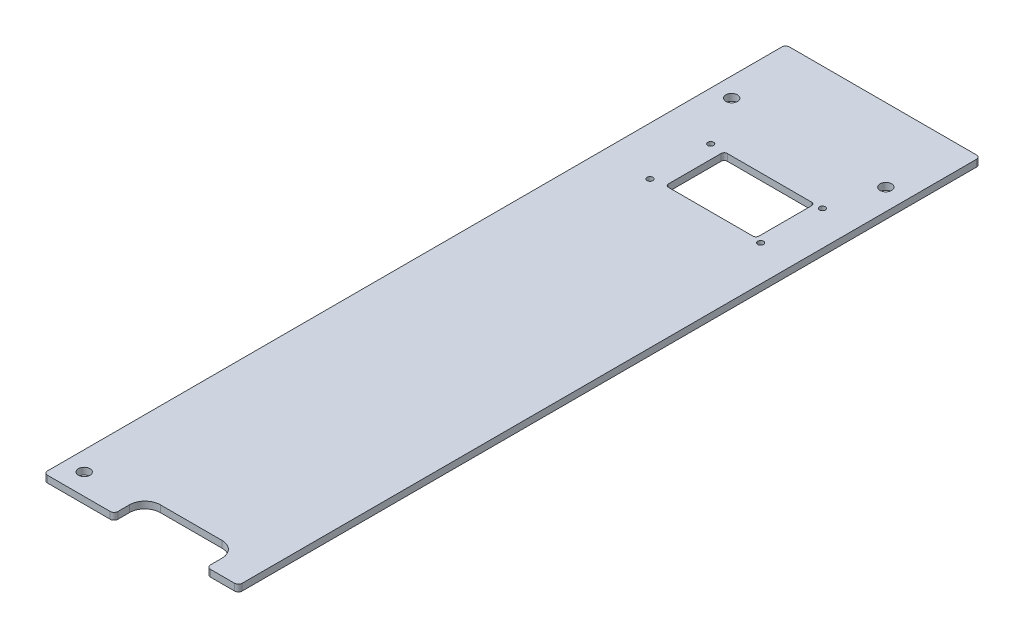
ISO-10303-21;
HEADER;
FILE_DESCRIPTION(('STEP AP214'),'2;1');
FILE_NAME('part.step','',(''),(''),'','','');
FILE_SCHEMA(('AUTOMOTIVE_DESIGN { 1 0 10303 214 1 1 1 1 }'));
ENDSEC;
DATA;
#1=APPLICATION_CONTEXT('core data for automotive mechanical design processes');
#2=APPLICATION_PROTOCOL_DEFINITION('international standard','automotive_design',2000,#1);
#3=PRODUCT_CONTEXT('',#1,'mechanical');
#4=PRODUCT('Part','Part','',(#3));
#5=PRODUCT_RELATED_PRODUCT_CATEGORY('part','',(#4));
#6=PRODUCT_DEFINITION_FORMATION('','',#4);
#7=PRODUCT_DEFINITION_CONTEXT('part definition',#1,'design');
#8=PRODUCT_DEFINITION('design','',#6,#7);
#9=PRODUCT_DEFINITION_SHAPE('','',#8);
#10=(LENGTH_UNIT() NAMED_UNIT(*) SI_UNIT(.MILLI.,.METRE.));
#11=(NAMED_UNIT(*) PLANE_ANGLE_UNIT() SI_UNIT($,.RADIAN.));
#12=(NAMED_UNIT(*) SI_UNIT($,.STERADIAN.) SOLID_ANGLE_UNIT());
#13=UNCERTAINTY_MEASURE_WITH_UNIT(LENGTH_MEASURE(1.E-05),#10,'distance_accuracy_value','');
#14=(GEOMETRIC_REPRESENTATION_CONTEXT(3) GLOBAL_UNCERTAINTY_ASSIGNED_CONTEXT((#13)) GLOBAL_UNIT_ASSIGNED_CONTEXT((#10,
#11,#12)) REPRESENTATION_CONTEXT('',''));
#15=CARTESIAN_POINT('',(0.,0.,0.));
#16=DIRECTION('',(0.,0.,1.));
#17=DIRECTION('',(1.,0.,0.));
#18=AXIS2_PLACEMENT_3D('',#15,#16,#17);
#19=CARTESIAN_POINT('',(-80.16875,5.588,305.59375));
#20=DIRECTION('',(0.,0.,-1.));
#21=DIRECTION('',(-1.,0.,0.));
#22=AXIS2_PLACEMENT_3D('',#19,#20,#21);
#23=PLANE('',#22);
#24=DIRECTION('',(1.,0.,0.));
#25=VECTOR('',#24,1.);
#26=CARTESIAN_POINT('',(-80.16875,0.,305.59375));
#27=LINE('',#26,#25);
#28=CARTESIAN_POINT('',(-76.99375,0.,305.59375));
#29=VERTEX_POINT('',#28);
#30=CARTESIAN_POINT('',(-25.4000000000001,0.,305.59375));
#31=VERTEX_POINT('',#30);
#32=EDGE_CURVE('E268',#29,#31,#27,.T.);
#33=ORIENTED_EDGE('',*,*,#32,.T.);
#34=DIRECTION('',(0.,1.,0.));
#35=VECTOR('',#34,1.);
#36=CARTESIAN_POINT('',(-25.4,5.588,305.59375));
#37=LINE('',#36,#35);
#38=CARTESIAN_POINT('',(-25.4000000000001,5.588,305.59375));
#39=VERTEX_POINT('',#38);
#40=EDGE_CURVE('E357',#31,#39,#37,.T.);
#41=ORIENTED_EDGE('',*,*,#40,.T.);
#42=DIRECTION('',(1.,0.,0.));
#43=VECTOR('',#42,1.);
#44=CARTESIAN_POINT('',(-80.16875,5.588,305.59375));
#45=LINE('',#44,#43);
#46=CARTESIAN_POINT('',(-76.99375,5.588,305.59375));
#47=VERTEX_POINT('',#46);
#48=EDGE_CURVE('E275',#47,#39,#45,.T.);
#49=ORIENTED_EDGE('',*,*,#48,.F.);
#50=DIRECTION('',(0.,-1.,0.));
#51=VECTOR('',#50,1.);
#52=CARTESIAN_POINT('',(-76.99375,5.588,305.59375));
#53=LINE('',#52,#51);
#54=EDGE_CURVE('E304',#47,#29,#53,.T.);
#55=ORIENTED_EDGE('',*,*,#54,.T.);
#56=EDGE_LOOP('',(#33,#41,#49,#55));
#57=FACE_BOUND('',#56,.T.);
#58=ADVANCED_FACE('F33',(#57),#23,.F.);
#59=CARTESIAN_POINT('',(80.16875,5.588,305.59375));
#60=DIRECTION('',(-1.,0.,0.));
#61=DIRECTION('',(0.,0.,1.));
#62=AXIS2_PLACEMENT_3D('',#59,#60,#61);
#63=PLANE('',#62);
#64=DIRECTION('',(0.,0.,-1.));
#65=VECTOR('',#64,1.);
#66=CARTESIAN_POINT('',(80.16875,5.588,305.59375));
#67=LINE('',#66,#65);
#68=CARTESIAN_POINT('',(80.16875,5.588,302.41875));
#69=VERTEX_POINT('',#68);
#70=CARTESIAN_POINT('',(80.16875,5.588,-302.41875));
#71=VERTEX_POINT('',#70);
#72=EDGE_CURVE('E264',#69,#71,#67,.T.);
#73=ORIENTED_EDGE('',*,*,#72,.F.);
#74=DIRECTION('',(0.,-1.,0.));
#75=VECTOR('',#74,1.);
#76=CARTESIAN_POINT('',(80.16875,5.588,302.41875));
#77=LINE('',#76,#75);
#78=CARTESIAN_POINT('',(80.16875,0.,302.41875));
#79=VERTEX_POINT('',#78);
#80=EDGE_CURVE('E292',#69,#79,#77,.T.);
#81=ORIENTED_EDGE('',*,*,#80,.T.);
#82=DIRECTION('',(0.,0.,-1.));
#83=VECTOR('',#82,1.);
#84=CARTESIAN_POINT('',(80.16875,0.,305.59375));
#85=LINE('',#84,#83);
#86=CARTESIAN_POINT('',(80.16875,0.,-302.41875));
#87=VERTEX_POINT('',#86);
#88=EDGE_CURVE('E279',#79,#87,#85,.T.);
#89=ORIENTED_EDGE('',*,*,#88,.T.);
#90=DIRECTION('',(0.,-1.,0.));
#91=VECTOR('',#90,1.);
#92=CARTESIAN_POINT('',(80.16875,5.588,-302.41875));
#93=LINE('',#92,#91);
#94=EDGE_CURVE('E278',#87,#71,#93,.F.);
#95=ORIENTED_EDGE('',*,*,#94,.T.);
#96=EDGE_LOOP('',(#73,#81,#89,#95));
#97=FACE_BOUND('',#96,.T.);
#98=ADVANCED_FACE('F438',(#97),#63,.F.);
#99=CARTESIAN_POINT('',(-80.16875,5.588,-305.59375));
#100=DIRECTION('',(0.,0.,1.));
#101=DIRECTION('',(1.,0.,0.));
#102=AXIS2_PLACEMENT_3D('',#99,#100,#101);
#103=PLANE('',#102);
#104=DIRECTION('',(-1.,0.,0.));
#105=VECTOR('',#104,1.);
#106=CARTESIAN_POINT('',(-80.16875,5.588,-305.59375));
#107=LINE('',#106,#105);
#108=CARTESIAN_POINT('',(76.9937499999999,5.588,-305.59375));
#109=VERTEX_POINT('',#108);
#110=CARTESIAN_POINT('',(-76.99375,5.588,-305.59375));
#111=VERTEX_POINT('',#110);
#112=EDGE_CURVE('E267',#109,#111,#107,.T.);
#113=ORIENTED_EDGE('',*,*,#112,.F.);
#114=DIRECTION('',(0.,-1.,0.));
#115=VECTOR('',#114,1.);
#116=CARTESIAN_POINT('',(76.9937499999999,5.588,-305.59375));
#117=LINE('',#116,#115);
#118=CARTESIAN_POINT('',(76.9937499999999,0.,-305.59375));
#119=VERTEX_POINT('',#118);
#120=EDGE_CURVE('E325',#109,#119,#117,.T.);
#121=ORIENTED_EDGE('',*,*,#120,.T.);
#122=DIRECTION('',(-1.,0.,0.));
#123=VECTOR('',#122,1.);
#124=CARTESIAN_POINT('',(-80.16875,0.,-305.59375));
#125=LINE('',#124,#123);
#126=CARTESIAN_POINT('',(-76.99375,0.,-305.59375));
#127=VERTEX_POINT('',#126);
#128=EDGE_CURVE('E282',#119,#127,#125,.T.);
#129=ORIENTED_EDGE('',*,*,#128,.T.);
#130=DIRECTION('',(0.,-1.,0.));
#131=VECTOR('',#130,1.);
#132=CARTESIAN_POINT('',(-76.99375,5.588,-305.59375));
#133=LINE('',#132,#131);
#134=EDGE_CURVE('E323',#127,#111,#133,.F.);
#135=ORIENTED_EDGE('',*,*,#134,.T.);
#136=EDGE_LOOP('',(#113,#121,#129,#135));
#137=FACE_BOUND('',#136,.T.);
#138=ADVANCED_FACE('F443',(#137),#103,.F.);
#139=CARTESIAN_POINT('',(-80.16875,5.588,305.59375));
#140=DIRECTION('',(1.,0.,0.));
#141=DIRECTION('',(0.,0.,-1.));
#142=AXIS2_PLACEMENT_3D('',#139,#140,#141);
#143=PLANE('',#142);
#144=DIRECTION('',(0.,0.,1.));
#145=VECTOR('',#144,1.);
#146=CARTESIAN_POINT('',(-80.16875,0.,305.59375));
#147=LINE('',#146,#145);
#148=CARTESIAN_POINT('',(-80.16875,0.,-302.41875));
#149=VERTEX_POINT('',#148);
#150=CARTESIAN_POINT('',(-80.16875,0.,302.41875));
#151=VERTEX_POINT('',#150);
#152=EDGE_CURVE('E285',#149,#151,#147,.T.);
#153=ORIENTED_EDGE('',*,*,#152,.T.);
#154=DIRECTION('',(0.,-1.,0.));
#155=VECTOR('',#154,1.);
#156=CARTESIAN_POINT('',(-80.16875,5.588,302.41875));
#157=LINE('',#156,#155);
#158=CARTESIAN_POINT('',(-80.16875,5.588,302.41875));
#159=VERTEX_POINT('',#158);
#160=EDGE_CURVE('E321',#151,#159,#157,.F.);
#161=ORIENTED_EDGE('',*,*,#160,.T.);
#162=DIRECTION('',(0.,0.,1.));
#163=VECTOR('',#162,1.);
#164=CARTESIAN_POINT('',(-80.16875,5.588,305.59375));
#165=LINE('',#164,#163);
#166=CARTESIAN_POINT('',(-80.16875,5.588,-302.41875));
#167=VERTEX_POINT('',#166);
#168=EDGE_CURVE('E271',#167,#159,#165,.T.);
#169=ORIENTED_EDGE('',*,*,#168,.F.);
#170=DIRECTION('',(0.,-1.,0.));
#171=VECTOR('',#170,1.);
#172=CARTESIAN_POINT('',(-80.16875,5.588,-302.41875));
#173=LINE('',#172,#171);
#174=EDGE_CURVE('E318',#167,#149,#173,.T.);
#175=ORIENTED_EDGE('',*,*,#174,.T.);
#176=EDGE_LOOP('',(#153,#161,#169,#175));
#177=FACE_BOUND('',#176,.T.);
#178=ADVANCED_FACE('F431',(#177),#143,.F.);
#179=CARTESIAN_POINT('',(57.1499999999999,5.588,305.59375));
#180=VERTEX_POINT('',#179);
#181=CARTESIAN_POINT('',(76.9937499999999,5.588,305.59375));
#182=VERTEX_POINT('',#181);
#183=EDGE_CURVE('E274',#180,#182,#45,.T.);
#184=ORIENTED_EDGE('',*,*,#183,.F.);
#185=DIRECTION('',(0.,1.,0.));
#186=VECTOR('',#185,1.);
#187=CARTESIAN_POINT('',(57.1499999999999,5.588,305.59375));
#188=LINE('',#187,#186);
#189=CARTESIAN_POINT('',(57.1499999999999,0.,305.59375));
#190=VERTEX_POINT('',#189);
#191=EDGE_CURVE('E350',#180,#190,#188,.F.);
#192=ORIENTED_EDGE('',*,*,#191,.T.);
#193=CARTESIAN_POINT('',(76.9937499999999,0.,305.59375));
#194=VERTEX_POINT('',#193);
#195=EDGE_CURVE('E288',#190,#194,#27,.T.);
#196=ORIENTED_EDGE('',*,*,#195,.T.);
#197=DIRECTION('',(0.,-1.,0.));
#198=VECTOR('',#197,1.);
#199=CARTESIAN_POINT('',(76.9937499999999,5.588,305.59375));
#200=LINE('',#199,#198);
#201=EDGE_CURVE('E307',#194,#182,#200,.F.);
#202=ORIENTED_EDGE('',*,*,#201,.T.);
#203=EDGE_LOOP('',(#184,#192,#196,#202));
#204=FACE_BOUND('',#203,.T.);
#205=ADVANCED_FACE('F421',(#204),#23,.F.);
#206=CARTESIAN_POINT('',(0.,5.588,0.));
#207=DIRECTION('',(0.,-1.,0.));
#208=DIRECTION('',(0.,0.,-1.));
#209=AXIS2_PLACEMENT_3D('',#206,#207,#208);
#210=PLANE('',#209);
#211=CARTESIAN_POINT('',(50.8952499999905,5.588,-153.95575));
#212=DIRECTION('',(0.,1.,0.));
#213=DIRECTION('',(0.,0.,1.));
#214=AXIS2_PLACEMENT_3D('',#211,#212,#213);
#215=CIRCLE('',#214,2.38125000000003);
#216=CARTESIAN_POINT('',(50.8952499999905,5.588,-151.5745));
#217=VERTEX_POINT('',#216);
#218=EDGE_CURVE('E411',#217,#217,#215,.T.);
#219=ORIENTED_EDGE('',*,*,#218,.F.);
#220=EDGE_LOOP('',(#219));
#221=FACE_BOUND('',#220,.T.);
#222=CARTESIAN_POINT('',(51.7450513885221,5.588,-203.99375));
#223=DIRECTION('',(0.,1.,0.));
#224=DIRECTION('',(0.,0.,1.));
#225=AXIS2_PLACEMENT_3D('',#222,#223,#224);
#226=CIRCLE('',#225,2.38125000000001);
#227=CARTESIAN_POINT('',(51.7450513885221,5.588,-201.6125));
#228=VERTEX_POINT('',#227);
#229=EDGE_CURVE('E401',#228,#228,#226,.T.);
#230=ORIENTED_EDGE('',*,*,#229,.F.);
#231=EDGE_LOOP('',(#230));
#232=FACE_BOUND('',#231,.T.);
#233=CARTESIAN_POINT('',(-40.2907500000095,5.588,-153.95575));
#234=DIRECTION('',(0.,1.,0.));
#235=DIRECTION('',(0.,0.,1.));
#236=AXIS2_PLACEMENT_3D('',#233,#234,#235);
#237=CIRCLE('',#236,2.38125000000003);
#238=CARTESIAN_POINT('',(-40.2907500000095,5.588,-151.5745));
#239=VERTEX_POINT('',#238);
#240=EDGE_CURVE('E398',#239,#239,#237,.T.);
#241=ORIENTED_EDGE('',*,*,#240,.F.);
#242=EDGE_LOOP('',(#241));
#243=FACE_BOUND('',#242,.T.);
#244=CARTESIAN_POINT('',(-40.2907500000095,5.588,-203.99375));
#245=DIRECTION('',(0.,1.,0.));
#246=DIRECTION('',(0.,0.,1.));
#247=AXIS2_PLACEMENT_3D('',#244,#245,#246);
#248=CIRCLE('',#247,2.38125000000003);
#249=CARTESIAN_POINT('',(-40.2907500000095,5.588,-201.6125));
#250=VERTEX_POINT('',#249);
#251=EDGE_CURVE('E395',#250,#250,#248,.T.);
#252=ORIENTED_EDGE('',*,*,#251,.F.);
#253=EDGE_LOOP('',(#252));
#254=FACE_BOUND('',#253,.T.);
#255=DIRECTION('',(0.,0.,-1.));
#256=VECTOR('',#255,1.);
#257=CARTESIAN_POINT('',(45.3793428288734,5.588,-201.45375));
#258=LINE('',#257,#256);
#259=CARTESIAN_POINT('',(45.3793428288734,5.588,-158.115));
#260=VERTEX_POINT('',#259);
#261=CARTESIAN_POINT('',(45.3793428288734,5.588,-201.45375));
#262=VERTEX_POINT('',#261);
#263=EDGE_CURVE('E207',#260,#262,#258,.T.);
#264=ORIENTED_EDGE('',*,*,#263,.F.);
#265=CARTESIAN_POINT('',(42.8393428288734,5.588,-158.115));
#266=DIRECTION('',(0.,1.,0.));
#267=DIRECTION('',(0.,0.,1.));
#268=AXIS2_PLACEMENT_3D('',#265,#266,#267);
#269=CIRCLE('',#268,2.53999999999999);
#270=CARTESIAN_POINT('',(42.8393428288734,5.588,-155.575));
#271=VERTEX_POINT('',#270);
#272=EDGE_CURVE('E50',#271,#260,#269,.T.);
#273=ORIENTED_EDGE('',*,*,#272,.F.);
#274=DIRECTION('',(1.,0.,0.));
#275=VECTOR('',#274,1.);
#276=CARTESIAN_POINT('',(-26.6382500000095,5.588,-155.575));
#277=LINE('',#276,#275);
#278=CARTESIAN_POINT('',(-26.6382500000095,5.588,-155.575));
#279=VERTEX_POINT('',#278);
#280=EDGE_CURVE('E229',#279,#271,#277,.T.);
#281=ORIENTED_EDGE('',*,*,#280,.F.);
#282=CARTESIAN_POINT('',(-26.6382500000095,5.588,-158.115));
#283=DIRECTION('',(0.,1.,0.));
#284=DIRECTION('',(0.,0.,1.));
#285=AXIS2_PLACEMENT_3D('',#282,#283,#284);
#286=CIRCLE('',#285,2.53999999999999);
#287=CARTESIAN_POINT('',(-29.1782500000095,5.588,-158.115));
#288=VERTEX_POINT('',#287);
#289=EDGE_CURVE('E226',#288,#279,#286,.T.);
#290=ORIENTED_EDGE('',*,*,#289,.F.);
#291=DIRECTION('',(0.,0.,1.));
#292=VECTOR('',#291,1.);
#293=CARTESIAN_POINT('',(-29.1782500000095,5.588,-201.45375));
#294=LINE('',#293,#292);
#295=CARTESIAN_POINT('',(-29.1782500000095,5.588,-201.45375));
#296=VERTEX_POINT('',#295);
#297=EDGE_CURVE('E223',#296,#288,#294,.T.);
#298=ORIENTED_EDGE('',*,*,#297,.F.);
#299=CARTESIAN_POINT('',(-26.6382500000095,5.588,-201.45375));
#300=DIRECTION('',(0.,1.,0.));
#301=DIRECTION('',(0.,0.,1.));
#302=AXIS2_PLACEMENT_3D('',#299,#300,#301);
#303=CIRCLE('',#302,2.53999999999999);
#304=CARTESIAN_POINT('',(-26.6382500000095,5.588,-203.99375));
#305=VERTEX_POINT('',#304);
#306=EDGE_CURVE('E217',#305,#296,#303,.T.);
#307=ORIENTED_EDGE('',*,*,#306,.F.);
#308=DIRECTION('',(-1.,0.,0.));
#309=VECTOR('',#308,1.);
#310=CARTESIAN_POINT('',(-26.6382500000095,5.588,-203.99375));
#311=LINE('',#310,#309);
#312=CARTESIAN_POINT('',(42.8393428288734,5.588,-203.99375));
#313=VERTEX_POINT('',#312);
#314=EDGE_CURVE('E215',#313,#305,#311,.T.);
#315=ORIENTED_EDGE('',*,*,#314,.F.);
#316=CARTESIAN_POINT('',(42.8393428288734,5.588,-201.45375));
#317=DIRECTION('',(0.,1.,0.));
#318=DIRECTION('',(0.,0.,-1.));
#319=AXIS2_PLACEMENT_3D('',#316,#317,#318);
#320=CIRCLE('',#319,2.53999999999999);
#321=EDGE_CURVE('E198',#262,#313,#320,.T.);
#322=ORIENTED_EDGE('',*,*,#321,.F.);
#323=EDGE_LOOP('',(#264,#273,#281,#290,#298,#307,#315,#322));
#324=FACE_BOUND('',#323,.T.);
#325=CARTESIAN_POINT('',(-64.29375,5.588,288.13125));
#326=DIRECTION('',(0.,1.,0.));
#327=DIRECTION('',(0.,0.,1.));
#328=AXIS2_PLACEMENT_3D('',#325,#326,#327);
#329=CIRCLE('',#328,4.7625);
#330=CARTESIAN_POINT('',(-64.29375,5.588,292.89375));
#331=VERTEX_POINT('',#330);
#332=EDGE_CURVE('E252',#331,#331,#329,.T.);
#333=ORIENTED_EDGE('',*,*,#332,.F.);
#334=EDGE_LOOP('',(#333));
#335=FACE_BOUND('',#334,.T.);
#336=CARTESIAN_POINT('',(-64.29375,5.588,-245.26875));
#337=DIRECTION('',(0.,1.,0.));
#338=DIRECTION('',(0.,0.,1.));
#339=AXIS2_PLACEMENT_3D('',#336,#337,#338);
#340=CIRCLE('',#339,4.7625);
#341=CARTESIAN_POINT('',(-64.29375,5.588,-240.50625));
#342=VERTEX_POINT('',#341);
#343=EDGE_CURVE('E256',#342,#342,#340,.T.);
#344=ORIENTED_EDGE('',*,*,#343,.F.);
#345=EDGE_LOOP('',(#344));
#346=FACE_BOUND('',#345,.T.);
#347=CARTESIAN_POINT('',(62.70625,5.588,-245.26875));
#348=DIRECTION('',(0.,1.,0.));
#349=DIRECTION('',(0.,0.,1.));
#350=AXIS2_PLACEMENT_3D('',#347,#348,#349);
#351=CIRCLE('',#350,4.7625);
#352=CARTESIAN_POINT('',(62.70625,5.588,-240.50625));
#353=VERTEX_POINT('',#352);
#354=EDGE_CURVE('E260',#353,#353,#351,.T.);
#355=ORIENTED_EDGE('',*,*,#354,.F.);
#356=EDGE_LOOP('',(#355));
#357=FACE_BOUND('',#356,.T.);
#358=DIRECTION('',(0.,0.,-1.));
#359=VECTOR('',#358,1.);
#360=CARTESIAN_POINT('',(53.975,5.588,305.59375));
#361=LINE('',#360,#359);
#362=CARTESIAN_POINT('',(53.975,5.588,302.41875));
#363=VERTEX_POINT('',#362);
#364=CARTESIAN_POINT('',(53.975,5.588,292.89375));
#365=VERTEX_POINT('',#364);
#366=EDGE_CURVE('E246',#363,#365,#361,.T.);
#367=ORIENTED_EDGE('',*,*,#366,.F.);
#368=CARTESIAN_POINT('',(57.1499999999999,5.588,302.41875));
#369=DIRECTION('',(0.,-1.,0.));
#370=DIRECTION('',(0.,0.,-1.));
#371=AXIS2_PLACEMENT_3D('',#368,#369,#370);
#372=CIRCLE('',#371,3.175);
#373=EDGE_CURVE('E348',#363,#180,#372,.F.);
#374=ORIENTED_EDGE('',*,*,#373,.T.);
#375=ORIENTED_EDGE('',*,*,#183,.T.);
#376=CARTESIAN_POINT('',(76.99375,5.588,302.41875));
#377=DIRECTION('',(0.,-1.,0.));
#378=DIRECTION('',(0.,0.,-1.));
#379=AXIS2_PLACEMENT_3D('',#376,#377,#378);
#380=CIRCLE('',#379,3.175);
#381=EDGE_CURVE('E316',#182,#69,#380,.F.);
#382=ORIENTED_EDGE('',*,*,#381,.T.);
#383=ORIENTED_EDGE('',*,*,#72,.T.);
#384=CARTESIAN_POINT('',(76.9937499999999,5.588,-302.41875));
#385=DIRECTION('',(0.,-1.,0.));
#386=DIRECTION('',(0.,0.,-1.));
#387=AXIS2_PLACEMENT_3D('',#384,#385,#386);
#388=CIRCLE('',#387,3.175);
#389=EDGE_CURVE('E312',#71,#109,#388,.F.);
#390=ORIENTED_EDGE('',*,*,#389,.T.);
#391=ORIENTED_EDGE('',*,*,#112,.T.);
#392=CARTESIAN_POINT('',(-76.99375,5.588,-302.41875));
#393=DIRECTION('',(0.,-1.,0.));
#394=DIRECTION('',(0.,0.,-1.));
#395=AXIS2_PLACEMENT_3D('',#392,#393,#394);
#396=CIRCLE('',#395,3.175);
#397=EDGE_CURVE('E310',#111,#167,#396,.F.);
#398=ORIENTED_EDGE('',*,*,#397,.T.);
#399=ORIENTED_EDGE('',*,*,#168,.T.);
#400=CARTESIAN_POINT('',(-76.99375,5.588,302.41875));
#401=DIRECTION('',(0.,-1.,0.));
#402=DIRECTION('',(0.,0.,-1.));
#403=AXIS2_PLACEMENT_3D('',#400,#401,#402);
#404=CIRCLE('',#403,3.175);
#405=EDGE_CURVE('E314',#159,#47,#404,.F.);
#406=ORIENTED_EDGE('',*,*,#405,.T.);
#407=ORIENTED_EDGE('',*,*,#48,.T.);
#408=CARTESIAN_POINT('',(-25.4,5.588,302.41875));
#409=DIRECTION('',(0.,-1.,0.));
#410=DIRECTION('',(0.,0.,-1.));
#411=AXIS2_PLACEMENT_3D('',#408,#409,#410);
#412=CIRCLE('',#411,3.175);
#413=CARTESIAN_POINT('',(-22.225,5.588,302.41875));
#414=VERTEX_POINT('',#413);
#415=EDGE_CURVE('E345',#39,#414,#412,.F.);
#416=ORIENTED_EDGE('',*,*,#415,.T.);
#417=DIRECTION('',(0.,0.,1.));
#418=VECTOR('',#417,1.);
#419=CARTESIAN_POINT('',(-22.225,5.588,305.59375));
#420=LINE('',#419,#418);
#421=CARTESIAN_POINT('',(-22.225,5.588,292.89375));
#422=VERTEX_POINT('',#421);
#423=EDGE_CURVE('E234',#422,#414,#420,.T.);
#424=ORIENTED_EDGE('',*,*,#423,.F.);
#425=CARTESIAN_POINT('',(-9.52500000000004,5.588,292.89375));
#426=DIRECTION('',(0.,-1.,0.));
#427=DIRECTION('',(0.,0.,-1.));
#428=AXIS2_PLACEMENT_3D('',#425,#426,#427);
#429=CIRCLE('',#428,12.7);
#430=CARTESIAN_POINT('',(-9.52500000000005,5.588,280.19375));
#431=VERTEX_POINT('',#430);
#432=EDGE_CURVE('E376',#422,#431,#429,.T.);
#433=ORIENTED_EDGE('',*,*,#432,.T.);
#434=DIRECTION('',(-1.,0.,0.));
#435=VECTOR('',#434,1.);
#436=CARTESIAN_POINT('',(-22.225,5.588,280.19375));
#437=LINE('',#436,#435);
#438=CARTESIAN_POINT('',(41.2749999999999,5.588,280.19375));
#439=VERTEX_POINT('',#438);
#440=EDGE_CURVE('E249',#439,#431,#437,.T.);
#441=ORIENTED_EDGE('',*,*,#440,.F.);
#442=CARTESIAN_POINT('',(41.275,5.588,292.89375));
#443=DIRECTION('',(0.,-1.,0.));
#444=DIRECTION('',(0.,0.,-1.));
#445=AXIS2_PLACEMENT_3D('',#442,#443,#444);
#446=CIRCLE('',#445,12.7);
#447=EDGE_CURVE('E372',#439,#365,#446,.T.);
#448=ORIENTED_EDGE('',*,*,#447,.T.);
#449=EDGE_LOOP('',(#367,#374,#375,#382,#383,#390,#391,#398,#399,#406,#407,#416,#424,#433,#441,#448));
#450=FACE_BOUND('',#449,.T.);
#451=ADVANCED_FACE('F211',(#221,#232,#243,#254,#324,#335,#346,#357,#450),#210,.F.);
#452=CARTESIAN_POINT('',(0.,0.,0.));
#453=DIRECTION('',(0.,-1.,0.));
#454=DIRECTION('',(0.,0.,-1.));
#455=AXIS2_PLACEMENT_3D('',#452,#453,#454);
#456=PLANE('',#455);
#457=CARTESIAN_POINT('',(50.8952499999905,0.,-153.95575));
#458=DIRECTION('',(0.,-1.,0.));
#459=DIRECTION('',(0.,0.,-1.));
#460=AXIS2_PLACEMENT_3D('',#457,#458,#459);
#461=CIRCLE('',#460,2.38125000000003);
#462=CARTESIAN_POINT('',(50.8952499999905,0.,-156.337));
#463=VERTEX_POINT('',#462);
#464=EDGE_CURVE('E37',#463,#463,#461,.T.);
#465=ORIENTED_EDGE('',*,*,#464,.F.);
#466=EDGE_LOOP('',(#465));
#467=FACE_BOUND('',#466,.T.);
#468=CARTESIAN_POINT('',(51.7450513885221,0.,-203.99375));
#469=DIRECTION('',(0.,-1.,0.));
#470=DIRECTION('',(0.,0.,-1.));
#471=AXIS2_PLACEMENT_3D('',#468,#469,#470);
#472=CIRCLE('',#471,2.38125000000001);
#473=CARTESIAN_POINT('',(51.7450513885221,0.,-206.375));
#474=VERTEX_POINT('',#473);
#475=EDGE_CURVE('E399',#474,#474,#472,.T.);
#476=ORIENTED_EDGE('',*,*,#475,.F.);
#477=EDGE_LOOP('',(#476));
#478=FACE_BOUND('',#477,.T.);
#479=CARTESIAN_POINT('',(-40.2907500000095,0.,-153.95575));
#480=DIRECTION('',(0.,-1.,0.));
#481=DIRECTION('',(0.,0.,-1.));
#482=AXIS2_PLACEMENT_3D('',#479,#480,#481);
#483=CIRCLE('',#482,2.38125000000003);
#484=CARTESIAN_POINT('',(-40.2907500000095,0.,-156.337));
#485=VERTEX_POINT('',#484);
#486=EDGE_CURVE('E396',#485,#485,#483,.T.);
#487=ORIENTED_EDGE('',*,*,#486,.F.);
#488=EDGE_LOOP('',(#487));
#489=FACE_BOUND('',#488,.T.);
#490=CARTESIAN_POINT('',(-40.2907500000095,0.,-203.99375));
#491=DIRECTION('',(0.,-1.,0.));
#492=DIRECTION('',(0.,0.,-1.));
#493=AXIS2_PLACEMENT_3D('',#490,#491,#492);
#494=CIRCLE('',#493,2.38125000000003);
#495=CARTESIAN_POINT('',(-40.2907500000095,0.,-206.375));
#496=VERTEX_POINT('',#495);
#497=EDGE_CURVE('E392',#496,#496,#494,.T.);
#498=ORIENTED_EDGE('',*,*,#497,.F.);
#499=EDGE_LOOP('',(#498));
#500=FACE_BOUND('',#499,.T.);
#501=CARTESIAN_POINT('',(42.8393428288734,0.,-158.115));
#502=DIRECTION('',(0.,-1.,0.));
#503=DIRECTION('',(0.,0.,-1.));
#504=AXIS2_PLACEMENT_3D('',#501,#502,#503);
#505=CIRCLE('',#504,2.53999999999999);
#506=CARTESIAN_POINT('',(45.3793428288734,0.,-158.115));
#507=VERTEX_POINT('',#506);
#508=CARTESIAN_POINT('',(42.8393428288734,0.,-155.575));
#509=VERTEX_POINT('',#508);
#510=EDGE_CURVE('E11',#507,#509,#505,.T.);
#511=ORIENTED_EDGE('',*,*,#510,.F.);
#512=DIRECTION('',(0.,0.,1.));
#513=VECTOR('',#512,1.);
#514=CARTESIAN_POINT('',(45.3793428288735,0.,0.));
#515=LINE('',#514,#513);
#516=CARTESIAN_POINT('',(45.3793428288734,0.,-201.45375));
#517=VERTEX_POINT('',#516);
#518=EDGE_CURVE('E380',#517,#507,#515,.T.);
#519=ORIENTED_EDGE('',*,*,#518,.F.);
#520=CARTESIAN_POINT('',(42.8393428288734,0.,-201.45375));
#521=DIRECTION('',(0.,-1.,0.));
#522=DIRECTION('',(0.,0.,-1.));
#523=AXIS2_PLACEMENT_3D('',#520,#521,#522);
#524=CIRCLE('',#523,2.53999999999999);
#525=CARTESIAN_POINT('',(42.8393428288734,0.,-203.99375));
#526=VERTEX_POINT('',#525);
#527=EDGE_CURVE('E201',#526,#517,#524,.T.);
#528=ORIENTED_EDGE('',*,*,#527,.F.);
#529=DIRECTION('',(1.,0.,0.));
#530=VECTOR('',#529,1.);
#531=CARTESIAN_POINT('',(0.,0.,-203.99375));
#532=LINE('',#531,#530);
#533=CARTESIAN_POINT('',(-26.6382500000095,0.,-203.99375));
#534=VERTEX_POINT('',#533);
#535=EDGE_CURVE('E383',#534,#526,#532,.T.);
#536=ORIENTED_EDGE('',*,*,#535,.F.);
#537=CARTESIAN_POINT('',(-26.6382500000095,0.,-201.45375));
#538=DIRECTION('',(0.,-1.,0.));
#539=DIRECTION('',(0.,0.,-1.));
#540=AXIS2_PLACEMENT_3D('',#537,#538,#539);
#541=CIRCLE('',#540,2.53999999999999);
#542=CARTESIAN_POINT('',(-29.1782500000095,0.,-201.45375));
#543=VERTEX_POINT('',#542);
#544=EDGE_CURVE('E385',#543,#534,#541,.T.);
#545=ORIENTED_EDGE('',*,*,#544,.F.);
#546=DIRECTION('',(0.,0.,-1.));
#547=VECTOR('',#546,1.);
#548=CARTESIAN_POINT('',(-29.1782500000095,0.,0.));
#549=LINE('',#548,#547);
#550=CARTESIAN_POINT('',(-29.1782500000095,0.,-158.115));
#551=VERTEX_POINT('',#550);
#552=EDGE_CURVE('E387',#551,#543,#549,.T.);
#553=ORIENTED_EDGE('',*,*,#552,.F.);
#554=CARTESIAN_POINT('',(-26.6382500000095,0.,-158.115));
#555=DIRECTION('',(0.,-1.,0.));
#556=DIRECTION('',(0.,0.,-1.));
#557=AXIS2_PLACEMENT_3D('',#554,#555,#556);
#558=CIRCLE('',#557,2.53999999999999);
#559=CARTESIAN_POINT('',(-26.6382500000095,0.,-155.575));
#560=VERTEX_POINT('',#559);
#561=EDGE_CURVE('E389',#560,#551,#558,.T.);
#562=ORIENTED_EDGE('',*,*,#561,.F.);
#563=DIRECTION('',(-1.,0.,0.));
#564=VECTOR('',#563,1.);
#565=CARTESIAN_POINT('',(0.,0.,-155.575));
#566=LINE('',#565,#564);
#567=EDGE_CURVE('E42',#509,#560,#566,.T.);
#568=ORIENTED_EDGE('',*,*,#567,.F.);
#569=EDGE_LOOP('',(#511,#519,#528,#536,#545,#553,#562,#568));
#570=FACE_BOUND('',#569,.T.);
#571=ORIENTED_EDGE('',*,*,#195,.F.);
#572=CARTESIAN_POINT('',(57.1499999999999,0.,302.41875));
#573=DIRECTION('',(0.,-1.,0.));
#574=DIRECTION('',(0.,0.,-1.));
#575=AXIS2_PLACEMENT_3D('',#572,#573,#574);
#576=CIRCLE('',#575,3.175);
#577=CARTESIAN_POINT('',(53.975,0.,302.41875));
#578=VERTEX_POINT('',#577);
#579=EDGE_CURVE('E354',#190,#578,#576,.T.);
#580=ORIENTED_EDGE('',*,*,#579,.T.);
#581=DIRECTION('',(0.,0.,1.));
#582=VECTOR('',#581,1.);
#583=CARTESIAN_POINT('',(53.975,0.,0.));
#584=LINE('',#583,#582);
#585=CARTESIAN_POINT('',(53.975,0.,292.89375));
#586=VERTEX_POINT('',#585);
#587=EDGE_CURVE('E328',#586,#578,#584,.T.);
#588=ORIENTED_EDGE('',*,*,#587,.F.);
#589=CARTESIAN_POINT('',(41.275,0.,292.89375));
#590=DIRECTION('',(0.,-1.,0.));
#591=DIRECTION('',(0.,0.,-1.));
#592=AXIS2_PLACEMENT_3D('',#589,#590,#591);
#593=CIRCLE('',#592,12.7);
#594=CARTESIAN_POINT('',(41.275,0.,280.19375));
#595=VERTEX_POINT('',#594);
#596=EDGE_CURVE('E374',#586,#595,#593,.F.);
#597=ORIENTED_EDGE('',*,*,#596,.T.);
#598=DIRECTION('',(1.,0.,0.));
#599=VECTOR('',#598,1.);
#600=CARTESIAN_POINT('',(0.,0.,280.19375));
#601=LINE('',#600,#599);
#602=CARTESIAN_POINT('',(-9.52500000000004,0.,280.19375));
#603=VERTEX_POINT('',#602);
#604=EDGE_CURVE('E336',#603,#595,#601,.T.);
#605=ORIENTED_EDGE('',*,*,#604,.F.);
#606=CARTESIAN_POINT('',(-9.52500000000004,0.,292.89375));
#607=DIRECTION('',(0.,-1.,0.));
#608=DIRECTION('',(0.,0.,-1.));
#609=AXIS2_PLACEMENT_3D('',#606,#607,#608);
#610=CIRCLE('',#609,12.7);
#611=CARTESIAN_POINT('',(-22.225,0.,292.89375));
#612=VERTEX_POINT('',#611);
#613=EDGE_CURVE('E378',#603,#612,#610,.F.);
#614=ORIENTED_EDGE('',*,*,#613,.T.);
#615=DIRECTION('',(0.,0.,-1.));
#616=VECTOR('',#615,1.);
#617=CARTESIAN_POINT('',(-22.225,0.,0.));
#618=LINE('',#617,#616);
#619=CARTESIAN_POINT('',(-22.225,0.,302.41875));
#620=VERTEX_POINT('',#619);
#621=EDGE_CURVE('E339',#620,#612,#618,.T.);
#622=ORIENTED_EDGE('',*,*,#621,.F.);
#623=CARTESIAN_POINT('',(-25.4,0.,302.41875));
#624=DIRECTION('',(0.,-1.,0.));
#625=DIRECTION('',(0.,0.,-1.));
#626=AXIS2_PLACEMENT_3D('',#623,#624,#625);
#627=CIRCLE('',#626,3.175);
#628=EDGE_CURVE('E352',#620,#31,#627,.T.);
#629=ORIENTED_EDGE('',*,*,#628,.T.);
#630=ORIENTED_EDGE('',*,*,#32,.F.);
#631=CARTESIAN_POINT('',(-76.99375,0.,302.41875));
#632=DIRECTION('',(0.,-1.,0.));
#633=DIRECTION('',(0.,0.,-1.));
#634=AXIS2_PLACEMENT_3D('',#631,#632,#633);
#635=CIRCLE('',#634,3.175);
#636=EDGE_CURVE('E299',#29,#151,#635,.T.);
#637=ORIENTED_EDGE('',*,*,#636,.T.);
#638=ORIENTED_EDGE('',*,*,#152,.F.);
#639=CARTESIAN_POINT('',(-76.99375,0.,-302.41875));
#640=DIRECTION('',(0.,-1.,0.));
#641=DIRECTION('',(0.,0.,-1.));
#642=AXIS2_PLACEMENT_3D('',#639,#640,#641);
#643=CIRCLE('',#642,3.175);
#644=EDGE_CURVE('E295',#149,#127,#643,.T.);
#645=ORIENTED_EDGE('',*,*,#644,.T.);
#646=ORIENTED_EDGE('',*,*,#128,.F.);
#647=CARTESIAN_POINT('',(76.9937499999999,0.,-302.41875));
#648=DIRECTION('',(0.,-1.,0.));
#649=DIRECTION('',(0.,0.,-1.));
#650=AXIS2_PLACEMENT_3D('',#647,#648,#649);
#651=CIRCLE('',#650,3.175);
#652=EDGE_CURVE('E297',#119,#87,#651,.T.);
#653=ORIENTED_EDGE('',*,*,#652,.T.);
#654=ORIENTED_EDGE('',*,*,#88,.F.);
#655=CARTESIAN_POINT('',(76.99375,0.,302.41875));
#656=DIRECTION('',(0.,-1.,0.));
#657=DIRECTION('',(0.,0.,-1.));
#658=AXIS2_PLACEMENT_3D('',#655,#656,#657);
#659=CIRCLE('',#658,3.175);
#660=EDGE_CURVE('E301',#79,#194,#659,.T.);
#661=ORIENTED_EDGE('',*,*,#660,.T.);
#662=EDGE_LOOP('',(#571,#580,#588,#597,#605,#614,#622,#629,#630,#637,#638,#645,#646,#653,#654,#661));
#663=FACE_BOUND('',#662,.T.);
#664=CARTESIAN_POINT('',(-64.29375,0.,288.13125));
#665=DIRECTION('',(0.,-1.,0.));
#666=DIRECTION('',(0.,0.,-1.));
#667=AXIS2_PLACEMENT_3D('',#664,#665,#666);
#668=CIRCLE('',#667,4.7625);
#669=CARTESIAN_POINT('',(-64.29375,0.,283.36875));
#670=VERTEX_POINT('',#669);
#671=EDGE_CURVE('E255',#670,#670,#668,.T.);
#672=ORIENTED_EDGE('',*,*,#671,.F.);
#673=EDGE_LOOP('',(#672));
#674=FACE_BOUND('',#673,.T.);
#675=CARTESIAN_POINT('',(-64.29375,0.,-245.26875));
#676=DIRECTION('',(0.,-1.,0.));
#677=DIRECTION('',(0.,0.,-1.));
#678=AXIS2_PLACEMENT_3D('',#675,#676,#677);
#679=CIRCLE('',#678,4.7625);
#680=CARTESIAN_POINT('',(-64.29375,0.,-250.03125));
#681=VERTEX_POINT('',#680);
#682=EDGE_CURVE('E259',#681,#681,#679,.T.);
#683=ORIENTED_EDGE('',*,*,#682,.F.);
#684=EDGE_LOOP('',(#683));
#685=FACE_BOUND('',#684,.T.);
#686=CARTESIAN_POINT('',(62.70625,0.,-245.26875));
#687=DIRECTION('',(0.,-1.,0.));
#688=DIRECTION('',(0.,0.,-1.));
#689=AXIS2_PLACEMENT_3D('',#686,#687,#688);
#690=CIRCLE('',#689,4.7625);
#691=CARTESIAN_POINT('',(62.70625,0.,-250.03125));
#692=VERTEX_POINT('',#691);
#693=EDGE_CURVE('E263',#692,#692,#690,.T.);
#694=ORIENTED_EDGE('',*,*,#693,.F.);
#695=EDGE_LOOP('',(#694));
#696=FACE_BOUND('',#695,.T.);
#697=ADVANCED_FACE('F420',(#467,#478,#489,#500,#570,#663,#674,#685,#696),#456,.T.);
#698=CARTESIAN_POINT('',(76.99375,5.588,302.41875));
#699=DIRECTION('',(0.,-1.,0.));
#700=DIRECTION('',(0.,0.,-1.));
#701=AXIS2_PLACEMENT_3D('',#698,#699,#700);
#702=CYLINDRICAL_SURFACE('',#701,3.175);
#703=ORIENTED_EDGE('',*,*,#381,.F.);
#704=ORIENTED_EDGE('',*,*,#201,.F.);
#705=ORIENTED_EDGE('',*,*,#660,.F.);
#706=ORIENTED_EDGE('',*,*,#80,.F.);
#707=EDGE_LOOP('',(#703,#704,#705,#706));
#708=FACE_BOUND('',#707,.T.);
#709=ADVANCED_FACE('F428',(#708),#702,.T.);
#710=CARTESIAN_POINT('',(-76.99375,5.588,302.41875));
#711=DIRECTION('',(0.,-1.,0.));
#712=DIRECTION('',(0.,0.,-1.));
#713=AXIS2_PLACEMENT_3D('',#710,#711,#712);
#714=CYLINDRICAL_SURFACE('',#713,3.175);
#715=ORIENTED_EDGE('',*,*,#405,.F.);
#716=ORIENTED_EDGE('',*,*,#160,.F.);
#717=ORIENTED_EDGE('',*,*,#636,.F.);
#718=ORIENTED_EDGE('',*,*,#54,.F.);
#719=EDGE_LOOP('',(#715,#716,#717,#718));
#720=FACE_BOUND('',#719,.T.);
#721=ADVANCED_FACE('F455',(#720),#714,.T.);
#722=CARTESIAN_POINT('',(76.9937499999999,5.588,-302.41875));
#723=DIRECTION('',(0.,-1.,0.));
#724=DIRECTION('',(0.,0.,-1.));
#725=AXIS2_PLACEMENT_3D('',#722,#723,#724);
#726=CYLINDRICAL_SURFACE('',#725,3.175);
#727=ORIENTED_EDGE('',*,*,#389,.F.);
#728=ORIENTED_EDGE('',*,*,#94,.F.);
#729=ORIENTED_EDGE('',*,*,#652,.F.);
#730=ORIENTED_EDGE('',*,*,#120,.F.);
#731=EDGE_LOOP('',(#727,#728,#729,#730));
#732=FACE_BOUND('',#731,.T.);
#733=ADVANCED_FACE('F459',(#732),#726,.T.);
#734=CARTESIAN_POINT('',(-76.99375,5.588,-302.41875));
#735=DIRECTION('',(0.,-1.,0.));
#736=DIRECTION('',(0.,0.,-1.));
#737=AXIS2_PLACEMENT_3D('',#734,#735,#736);
#738=CYLINDRICAL_SURFACE('',#737,3.175);
#739=ORIENTED_EDGE('',*,*,#397,.F.);
#740=ORIENTED_EDGE('',*,*,#134,.F.);
#741=ORIENTED_EDGE('',*,*,#644,.F.);
#742=ORIENTED_EDGE('',*,*,#174,.F.);
#743=EDGE_LOOP('',(#739,#740,#741,#742));
#744=FACE_BOUND('',#743,.T.);
#745=ADVANCED_FACE('F463',(#744),#738,.T.);
#746=CARTESIAN_POINT('',(62.70625,-0.762,-245.26875));
#747=DIRECTION('',(0.,1.,0.));
#748=DIRECTION('',(0.,0.,1.));
#749=AXIS2_PLACEMENT_3D('',#746,#747,#748);
#750=CYLINDRICAL_SURFACE('',#749,4.7625);
#751=ORIENTED_EDGE('',*,*,#693,.T.);
#752=EDGE_LOOP('',(#751));
#753=FACE_BOUND('',#752,.T.);
#754=ORIENTED_EDGE('',*,*,#354,.T.);
#755=EDGE_LOOP('',(#754));
#756=FACE_BOUND('',#755,.T.);
#757=ADVANCED_FACE('F467',(#753,#756),#750,.F.);
#758=CARTESIAN_POINT('',(-64.29375,-0.762,-245.26875));
#759=DIRECTION('',(0.,1.,0.));
#760=DIRECTION('',(0.,0.,1.));
#761=AXIS2_PLACEMENT_3D('',#758,#759,#760);
#762=CYLINDRICAL_SURFACE('',#761,4.7625);
#763=ORIENTED_EDGE('',*,*,#682,.T.);
#764=EDGE_LOOP('',(#763));
#765=FACE_BOUND('',#764,.T.);
#766=ORIENTED_EDGE('',*,*,#343,.T.);
#767=EDGE_LOOP('',(#766));
#768=FACE_BOUND('',#767,.T.);
#769=ADVANCED_FACE('F546',(#765,#768),#762,.F.);
#770=CARTESIAN_POINT('',(-64.29375,-0.762,288.13125));
#771=DIRECTION('',(0.,1.,0.));
#772=DIRECTION('',(0.,0.,1.));
#773=AXIS2_PLACEMENT_3D('',#770,#771,#772);
#774=CYLINDRICAL_SURFACE('',#773,4.7625);
#775=ORIENTED_EDGE('',*,*,#671,.T.);
#776=EDGE_LOOP('',(#775));
#777=FACE_BOUND('',#776,.T.);
#778=ORIENTED_EDGE('',*,*,#332,.T.);
#779=EDGE_LOOP('',(#778));
#780=FACE_BOUND('',#779,.T.);
#781=ADVANCED_FACE('F543',(#777,#780),#774,.F.);
#782=CARTESIAN_POINT('',(-22.225,-0.762,305.59375));
#783=DIRECTION('',(-1.,0.,0.));
#784=DIRECTION('',(0.,0.,1.));
#785=AXIS2_PLACEMENT_3D('',#782,#783,#784);
#786=PLANE('',#785);
#787=ORIENTED_EDGE('',*,*,#621,.T.);
#788=DIRECTION('',(0.,1.,0.));
#789=VECTOR('',#788,1.);
#790=CARTESIAN_POINT('',(-22.225,5.588,292.89375));
#791=LINE('',#790,#789);
#792=EDGE_CURVE('E369',#612,#422,#791,.T.);
#793=ORIENTED_EDGE('',*,*,#792,.T.);
#794=ORIENTED_EDGE('',*,*,#423,.T.);
#795=DIRECTION('',(0.,1.,0.));
#796=VECTOR('',#795,1.);
#797=CARTESIAN_POINT('',(-22.225,-0.762,302.41875));
#798=LINE('',#797,#796);
#799=EDGE_CURVE('E360',#414,#620,#798,.F.);
#800=ORIENTED_EDGE('',*,*,#799,.T.);
#801=EDGE_LOOP('',(#787,#793,#794,#800));
#802=FACE_BOUND('',#801,.T.);
#803=ADVANCED_FACE('F502',(#802),#786,.F.);
#804=CARTESIAN_POINT('',(-22.225,-0.762,280.19375));
#805=DIRECTION('',(0.,0.,-1.));
#806=DIRECTION('',(-1.,0.,0.));
#807=AXIS2_PLACEMENT_3D('',#804,#805,#806);
#808=PLANE('',#807);
#809=ORIENTED_EDGE('',*,*,#604,.T.);
#810=DIRECTION('',(0.,1.,0.));
#811=VECTOR('',#810,1.);
#812=CARTESIAN_POINT('',(41.275,5.588,280.19375));
#813=LINE('',#812,#811);
#814=EDGE_CURVE('E364',#595,#439,#813,.T.);
#815=ORIENTED_EDGE('',*,*,#814,.T.);
#816=ORIENTED_EDGE('',*,*,#440,.T.);
#817=DIRECTION('',(0.,1.,0.));
#818=VECTOR('',#817,1.);
#819=CARTESIAN_POINT('',(-9.52500000000004,0.,280.19375));
#820=LINE('',#819,#818);
#821=EDGE_CURVE('E362',#431,#603,#820,.F.);
#822=ORIENTED_EDGE('',*,*,#821,.T.);
#823=EDGE_LOOP('',(#809,#815,#816,#822));
#824=FACE_BOUND('',#823,.T.);
#825=ADVANCED_FACE('F495',(#824),#808,.F.);
#826=CARTESIAN_POINT('',(53.975,-0.762,305.59375));
#827=DIRECTION('',(1.,0.,0.));
#828=DIRECTION('',(0.,0.,-1.));
#829=AXIS2_PLACEMENT_3D('',#826,#827,#828);
#830=PLANE('',#829);
#831=ORIENTED_EDGE('',*,*,#366,.T.);
#832=DIRECTION('',(0.,1.,0.));
#833=VECTOR('',#832,1.);
#834=CARTESIAN_POINT('',(53.975,0.,292.89375));
#835=LINE('',#834,#833);
#836=EDGE_CURVE('E367',#365,#586,#835,.F.);
#837=ORIENTED_EDGE('',*,*,#836,.T.);
#838=ORIENTED_EDGE('',*,*,#587,.T.);
#839=DIRECTION('',(0.,1.,0.));
#840=VECTOR('',#839,1.);
#841=CARTESIAN_POINT('',(53.975,-0.762,302.41875));
#842=LINE('',#841,#840);
#843=EDGE_CURVE('E342',#578,#363,#842,.T.);
#844=ORIENTED_EDGE('',*,*,#843,.T.);
#845=EDGE_LOOP('',(#831,#837,#838,#844));
#846=FACE_BOUND('',#845,.T.);
#847=ADVANCED_FACE('F473',(#846),#830,.F.);
#848=CARTESIAN_POINT('',(57.1499999999999,-0.762,302.41875));
#849=DIRECTION('',(0.,1.,0.));
#850=DIRECTION('',(0.,0.,1.));
#851=AXIS2_PLACEMENT_3D('',#848,#849,#850);
#852=CYLINDRICAL_SURFACE('',#851,3.175);
#853=ORIENTED_EDGE('',*,*,#579,.F.);
#854=ORIENTED_EDGE('',*,*,#191,.F.);
#855=ORIENTED_EDGE('',*,*,#373,.F.);
#856=ORIENTED_EDGE('',*,*,#843,.F.);
#857=EDGE_LOOP('',(#853,#854,#855,#856));
#858=FACE_BOUND('',#857,.T.);
#859=ADVANCED_FACE('F469',(#858),#852,.T.);
#860=CARTESIAN_POINT('',(-25.4,5.588,302.41875));
#861=DIRECTION('',(0.,1.,0.));
#862=DIRECTION('',(0.,0.,1.));
#863=AXIS2_PLACEMENT_3D('',#860,#861,#862);
#864=CYLINDRICAL_SURFACE('',#863,3.175);
#865=ORIENTED_EDGE('',*,*,#628,.F.);
#866=ORIENTED_EDGE('',*,*,#799,.F.);
#867=ORIENTED_EDGE('',*,*,#415,.F.);
#868=ORIENTED_EDGE('',*,*,#40,.F.);
#869=EDGE_LOOP('',(#865,#866,#867,#868));
#870=FACE_BOUND('',#869,.T.);
#871=ADVANCED_FACE('F472',(#870),#864,.T.);
#872=CARTESIAN_POINT('',(41.275,-0.762,292.89375));
#873=DIRECTION('',(0.,-1.,0.));
#874=DIRECTION('',(0.,0.,-1.));
#875=AXIS2_PLACEMENT_3D('',#872,#873,#874);
#876=CYLINDRICAL_SURFACE('',#875,12.7);
#877=ORIENTED_EDGE('',*,*,#596,.F.);
#878=ORIENTED_EDGE('',*,*,#836,.F.);
#879=ORIENTED_EDGE('',*,*,#447,.F.);
#880=ORIENTED_EDGE('',*,*,#814,.F.);
#881=EDGE_LOOP('',(#877,#878,#879,#880));
#882=FACE_BOUND('',#881,.T.);
#883=ADVANCED_FACE('F476',(#882),#876,.F.);
#884=CARTESIAN_POINT('',(-9.52500000000004,-0.762,292.89375));
#885=DIRECTION('',(0.,-1.,0.));
#886=DIRECTION('',(0.,0.,-1.));
#887=AXIS2_PLACEMENT_3D('',#884,#885,#886);
#888=CYLINDRICAL_SURFACE('',#887,12.7);
#889=ORIENTED_EDGE('',*,*,#613,.F.);
#890=ORIENTED_EDGE('',*,*,#821,.F.);
#891=ORIENTED_EDGE('',*,*,#432,.F.);
#892=ORIENTED_EDGE('',*,*,#792,.F.);
#893=EDGE_LOOP('',(#889,#890,#891,#892));
#894=FACE_BOUND('',#893,.T.);
#895=ADVANCED_FACE('F35',(#894),#888,.F.);
#896=CARTESIAN_POINT('',(42.8393428288734,-19.812,-158.115));
#897=DIRECTION('',(0.,1.,0.));
#898=DIRECTION('',(0.,0.,1.));
#899=AXIS2_PLACEMENT_3D('',#896,#897,#898);
#900=CYLINDRICAL_SURFACE('',#899,2.53999999999999);
#901=ORIENTED_EDGE('',*,*,#510,.T.);
#902=DIRECTION('',(0.,1.,0.));
#903=VECTOR('',#902,1.);
#904=CARTESIAN_POINT('',(42.8393428288734,-19.812,-155.575));
#905=LINE('',#904,#903);
#906=EDGE_CURVE('E232',#509,#271,#905,.T.);
#907=ORIENTED_EDGE('',*,*,#906,.T.);
#908=ORIENTED_EDGE('',*,*,#272,.T.);
#909=DIRECTION('',(0.,1.,0.));
#910=VECTOR('',#909,1.);
#911=CARTESIAN_POINT('',(45.3793428288734,-19.812,-158.115));
#912=LINE('',#911,#910);
#913=EDGE_CURVE('E204',#507,#260,#912,.T.);
#914=ORIENTED_EDGE('',*,*,#913,.F.);
#915=EDGE_LOOP('',(#901,#907,#908,#914));
#916=FACE_BOUND('',#915,.T.);
#917=ADVANCED_FACE('F483',(#916),#900,.F.);
#918=CARTESIAN_POINT('',(-26.6382500000095,-19.812,-155.575));
#919=DIRECTION('',(0.,0.,1.));
#920=DIRECTION('',(1.,0.,0.));
#921=AXIS2_PLACEMENT_3D('',#918,#919,#920);
#922=PLANE('',#921);
#923=ORIENTED_EDGE('',*,*,#567,.T.);
#924=DIRECTION('',(0.,1.,0.));
#925=VECTOR('',#924,1.);
#926=CARTESIAN_POINT('',(-26.6382500000095,-19.812,-155.575));
#927=LINE('',#926,#925);
#928=EDGE_CURVE('E235',#560,#279,#927,.T.);
#929=ORIENTED_EDGE('',*,*,#928,.T.);
#930=ORIENTED_EDGE('',*,*,#280,.T.);
#931=ORIENTED_EDGE('',*,*,#906,.F.);
#932=EDGE_LOOP('',(#923,#929,#930,#931));
#933=FACE_BOUND('',#932,.T.);
#934=ADVANCED_FACE('F615',(#933),#922,.F.);
#935=CARTESIAN_POINT('',(-26.6382500000095,-19.812,-158.115));
#936=DIRECTION('',(0.,1.,0.));
#937=DIRECTION('',(0.,0.,1.));
#938=AXIS2_PLACEMENT_3D('',#935,#936,#937);
#939=CYLINDRICAL_SURFACE('',#938,2.53999999999999);
#940=ORIENTED_EDGE('',*,*,#561,.T.);
#941=DIRECTION('',(0.,1.,0.));
#942=VECTOR('',#941,1.);
#943=CARTESIAN_POINT('',(-29.1782500000095,-19.812,-158.115));
#944=LINE('',#943,#942);
#945=EDGE_CURVE('E237',#551,#288,#944,.T.);
#946=ORIENTED_EDGE('',*,*,#945,.T.);
#947=ORIENTED_EDGE('',*,*,#289,.T.);
#948=ORIENTED_EDGE('',*,*,#928,.F.);
#949=EDGE_LOOP('',(#940,#946,#947,#948));
#950=FACE_BOUND('',#949,.T.);
#951=ADVANCED_FACE('F623',(#950),#939,.F.);
#952=CARTESIAN_POINT('',(-29.1782500000095,-19.812,-201.45375));
#953=DIRECTION('',(-1.,0.,0.));
#954=DIRECTION('',(0.,0.,1.));
#955=AXIS2_PLACEMENT_3D('',#952,#953,#954);
#956=PLANE('',#955);
#957=ORIENTED_EDGE('',*,*,#552,.T.);
#958=DIRECTION('',(0.,1.,0.));
#959=VECTOR('',#958,1.);
#960=CARTESIAN_POINT('',(-29.1782500000095,-19.812,-201.45375));
#961=LINE('',#960,#959);
#962=EDGE_CURVE('E239',#543,#296,#961,.T.);
#963=ORIENTED_EDGE('',*,*,#962,.T.);
#964=ORIENTED_EDGE('',*,*,#297,.T.);
#965=ORIENTED_EDGE('',*,*,#945,.F.);
#966=EDGE_LOOP('',(#957,#963,#964,#965));
#967=FACE_BOUND('',#966,.T.);
#968=ADVANCED_FACE('F633',(#967),#956,.F.);
#969=CARTESIAN_POINT('',(-26.6382500000095,-19.812,-201.45375));
#970=DIRECTION('',(0.,1.,0.));
#971=DIRECTION('',(0.,0.,1.));
#972=AXIS2_PLACEMENT_3D('',#969,#970,#971);
#973=CYLINDRICAL_SURFACE('',#972,2.53999999999999);
#974=ORIENTED_EDGE('',*,*,#544,.T.);
#975=DIRECTION('',(0.,1.,0.));
#976=VECTOR('',#975,1.);
#977=CARTESIAN_POINT('',(-26.6382500000095,-19.812,-203.99375));
#978=LINE('',#977,#976);
#979=EDGE_CURVE('E241',#534,#305,#978,.T.);
#980=ORIENTED_EDGE('',*,*,#979,.T.);
#981=ORIENTED_EDGE('',*,*,#306,.T.);
#982=ORIENTED_EDGE('',*,*,#962,.F.);
#983=EDGE_LOOP('',(#974,#980,#981,#982));
#984=FACE_BOUND('',#983,.T.);
#985=ADVANCED_FACE('F643',(#984),#973,.F.);
#986=CARTESIAN_POINT('',(-26.6382500000095,-19.812,-203.99375));
#987=DIRECTION('',(0.,0.,-1.));
#988=DIRECTION('',(-1.,0.,0.));
#989=AXIS2_PLACEMENT_3D('',#986,#987,#988);
#990=PLANE('',#989);
#991=ORIENTED_EDGE('',*,*,#535,.T.);
#992=DIRECTION('',(0.,1.,0.));
#993=VECTOR('',#992,1.);
#994=CARTESIAN_POINT('',(42.8393428288734,-19.812,-203.99375));
#995=LINE('',#994,#993);
#996=EDGE_CURVE('E203',#526,#313,#995,.T.);
#997=ORIENTED_EDGE('',*,*,#996,.T.);
#998=ORIENTED_EDGE('',*,*,#314,.T.);
#999=ORIENTED_EDGE('',*,*,#979,.F.);
#1000=EDGE_LOOP('',(#991,#997,#998,#999));
#1001=FACE_BOUND('',#1000,.T.);
#1002=ADVANCED_FACE('F653',(#1001),#990,.F.);
#1003=CARTESIAN_POINT('',(42.8393428288734,-19.812,-201.45375));
#1004=DIRECTION('',(0.,1.,0.));
#1005=DIRECTION('',(0.,0.,1.));
#1006=AXIS2_PLACEMENT_3D('',#1003,#1004,#1005);
#1007=CYLINDRICAL_SURFACE('',#1006,2.53999999999999);
#1008=ORIENTED_EDGE('',*,*,#527,.T.);
#1009=DIRECTION('',(0.,1.,0.));
#1010=VECTOR('',#1009,1.);
#1011=CARTESIAN_POINT('',(45.3793428288734,-19.812,-201.45375));
#1012=LINE('',#1011,#1010);
#1013=EDGE_CURVE('E58',#517,#262,#1012,.T.);
#1014=ORIENTED_EDGE('',*,*,#1013,.T.);
#1015=ORIENTED_EDGE('',*,*,#321,.T.);
#1016=ORIENTED_EDGE('',*,*,#996,.F.);
#1017=EDGE_LOOP('',(#1008,#1014,#1015,#1016));
#1018=FACE_BOUND('',#1017,.T.);
#1019=ADVANCED_FACE('F195',(#1018),#1007,.F.);
#1020=CARTESIAN_POINT('',(45.3793428288734,-19.812,-201.45375));
#1021=DIRECTION('',(1.,0.,0.));
#1022=DIRECTION('',(0.,0.,-1.));
#1023=AXIS2_PLACEMENT_3D('',#1020,#1021,#1022);
#1024=PLANE('',#1023);
#1025=ORIENTED_EDGE('',*,*,#518,.T.);
#1026=ORIENTED_EDGE('',*,*,#913,.T.);
#1027=ORIENTED_EDGE('',*,*,#263,.T.);
#1028=ORIENTED_EDGE('',*,*,#1013,.F.);
#1029=EDGE_LOOP('',(#1025,#1026,#1027,#1028));
#1030=FACE_BOUND('',#1029,.T.);
#1031=ADVANCED_FACE('F208',(#1030),#1024,.F.);
#1032=CARTESIAN_POINT('',(-40.2907500000095,-19.812,-203.99375));
#1033=DIRECTION('',(0.,1.,0.));
#1034=DIRECTION('',(0.,0.,1.));
#1035=AXIS2_PLACEMENT_3D('',#1032,#1033,#1034);
#1036=CYLINDRICAL_SURFACE('',#1035,2.38125000000003);
#1037=ORIENTED_EDGE('',*,*,#497,.T.);
#1038=EDGE_LOOP('',(#1037));
#1039=FACE_BOUND('',#1038,.T.);
#1040=ORIENTED_EDGE('',*,*,#251,.T.);
#1041=EDGE_LOOP('',(#1040));
#1042=FACE_BOUND('',#1041,.T.);
#1043=ADVANCED_FACE('F417',(#1039,#1042),#1036,.F.);
#1044=CARTESIAN_POINT('',(-40.2907500000095,-19.812,-153.95575));
#1045=DIRECTION('',(0.,1.,0.));
#1046=DIRECTION('',(0.,0.,1.));
#1047=AXIS2_PLACEMENT_3D('',#1044,#1045,#1046);
#1048=CYLINDRICAL_SURFACE('',#1047,2.38125000000003);
#1049=ORIENTED_EDGE('',*,*,#486,.T.);
#1050=EDGE_LOOP('',(#1049));
#1051=FACE_BOUND('',#1050,.T.);
#1052=ORIENTED_EDGE('',*,*,#240,.T.);
#1053=EDGE_LOOP('',(#1052));
#1054=FACE_BOUND('',#1053,.T.);
#1055=ADVANCED_FACE('F688',(#1051,#1054),#1048,.F.);
#1056=CARTESIAN_POINT('',(51.7450513885221,-19.812,-203.99375));
#1057=DIRECTION('',(0.,1.,0.));
#1058=DIRECTION('',(0.,0.,1.));
#1059=AXIS2_PLACEMENT_3D('',#1056,#1057,#1058);
#1060=CYLINDRICAL_SURFACE('',#1059,2.38125000000001);
#1061=ORIENTED_EDGE('',*,*,#475,.T.);
#1062=EDGE_LOOP('',(#1061));
#1063=FACE_BOUND('',#1062,.T.);
#1064=ORIENTED_EDGE('',*,*,#229,.T.);
#1065=EDGE_LOOP('',(#1064));
#1066=FACE_BOUND('',#1065,.T.);
#1067=ADVANCED_FACE('F698',(#1063,#1066),#1060,.F.);
#1068=CARTESIAN_POINT('',(50.8952499999905,-19.812,-153.95575));
#1069=DIRECTION('',(0.,1.,0.));
#1070=DIRECTION('',(0.,0.,1.));
#1071=AXIS2_PLACEMENT_3D('',#1068,#1069,#1070);
#1072=CYLINDRICAL_SURFACE('',#1071,2.38125000000003);
#1073=ORIENTED_EDGE('',*,*,#464,.T.);
#1074=EDGE_LOOP('',(#1073));
#1075=FACE_BOUND('',#1074,.T.);
#1076=ORIENTED_EDGE('',*,*,#218,.T.);
#1077=EDGE_LOOP('',(#1076));
#1078=FACE_BOUND('',#1077,.T.);
#1079=ADVANCED_FACE('F708',(#1075,#1078),#1072,.F.);
#1080=CLOSED_SHELL('',(#58,#98,#138,#178,#205,#451,#697,#709,#721,#733,#745,#757,#769,#781,#803,
#825,#847,#859,#871,#883,#895,#917,#934,#951,#968,#985,#1002,#1019,#1031,#1043,#1055,#1067,#1079));
#1081=MANIFOLD_SOLID_BREP('B2',#1080);
#1082=ADVANCED_BREP_SHAPE_REPRESENTATION('',(#18,#1081),#14);
#1083=SHAPE_DEFINITION_REPRESENTATION(#9,#1082);
ENDSEC;
END-ISO-10303-21;
